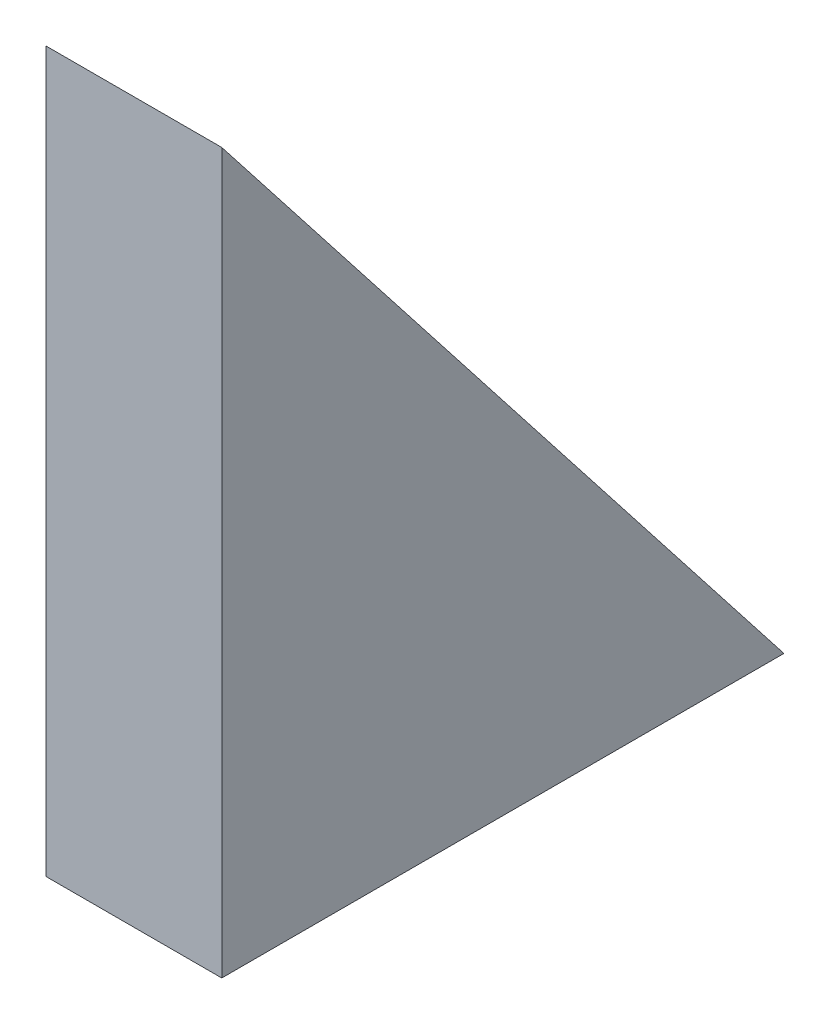
ISO-10303-21;
HEADER;
FILE_DESCRIPTION(('STEP AP214'),'2;1');
FILE_NAME('part.step','',(''),(''),'','','');
FILE_SCHEMA(('AUTOMOTIVE_DESIGN { 1 0 10303 214 1 1 1 1 }'));
ENDSEC;
DATA;
#1=APPLICATION_CONTEXT('core data for automotive mechanical design processes');
#2=APPLICATION_PROTOCOL_DEFINITION('international standard','automotive_design',2000,#1);
#3=PRODUCT_CONTEXT('',#1,'mechanical');
#4=PRODUCT('Part','Part','',(#3));
#5=PRODUCT_RELATED_PRODUCT_CATEGORY('part','',(#4));
#6=PRODUCT_DEFINITION_FORMATION('','',#4);
#7=PRODUCT_DEFINITION_CONTEXT('part definition',#1,'design');
#8=PRODUCT_DEFINITION('design','',#6,#7);
#9=PRODUCT_DEFINITION_SHAPE('','',#8);
#10=(LENGTH_UNIT() NAMED_UNIT(*) SI_UNIT(.MILLI.,.METRE.));
#11=(NAMED_UNIT(*) PLANE_ANGLE_UNIT() SI_UNIT($,.RADIAN.));
#12=(NAMED_UNIT(*) SI_UNIT($,.STERADIAN.) SOLID_ANGLE_UNIT());
#13=UNCERTAINTY_MEASURE_WITH_UNIT(LENGTH_MEASURE(1.E-05),#10,'distance_accuracy_value','');
#14=(GEOMETRIC_REPRESENTATION_CONTEXT(3) GLOBAL_UNCERTAINTY_ASSIGNED_CONTEXT((#13)) GLOBAL_UNIT_ASSIGNED_CONTEXT((#10,
#11,#12)) REPRESENTATION_CONTEXT('',''));
#15=CARTESIAN_POINT('',(0.,0.,0.));
#16=DIRECTION('',(0.,0.,1.));
#17=DIRECTION('',(1.,0.,0.));
#18=AXIS2_PLACEMENT_3D('',#15,#16,#17);
#19=CARTESIAN_POINT('',(7.9375,3.88578058618805E-13,-50.8));
#20=DIRECTION('',(0.,1.,0.));
#21=DIRECTION('',(0.,0.,1.));
#22=AXIS2_PLACEMENT_3D('',#19,#20,#21);
#23=PLANE('',#22);
#24=DIRECTION('',(0.,0.,-1.));
#25=VECTOR('',#24,1.);
#26=CARTESIAN_POINT('',(-7.93749999999999,3.88578058618805E-13,-50.7999999999998));
#27=LINE('',#26,#25);
#28=CARTESIAN_POINT('',(-7.9375,0.,2.22044604925031E-13));
#29=VERTEX_POINT('',#28);
#30=CARTESIAN_POINT('',(-7.93749999999999,3.88578058618805E-13,-50.7999999999998));
#31=VERTEX_POINT('',#30);
#32=EDGE_CURVE('E82',#29,#31,#27,.T.);
#33=ORIENTED_EDGE('',*,*,#32,.T.);
#34=DIRECTION('',(-1.,0.,0.));
#35=VECTOR('',#34,1.);
#36=CARTESIAN_POINT('',(7.9375,3.88578058618805E-13,-50.8));
#37=LINE('',#36,#35);
#38=CARTESIAN_POINT('',(7.9375,3.88578058618805E-13,-50.8));
#39=VERTEX_POINT('',#38);
#40=EDGE_CURVE('E11',#39,#31,#37,.T.);
#41=ORIENTED_EDGE('',*,*,#40,.F.);
#42=DIRECTION('',(0.,0.,-1.));
#43=VECTOR('',#42,1.);
#44=CARTESIAN_POINT('',(7.9375,3.88578058618805E-13,-50.8));
#45=LINE('',#44,#43);
#46=CARTESIAN_POINT('',(7.9375,0.,0.));
#47=VERTEX_POINT('',#46);
#48=EDGE_CURVE('E75',#47,#39,#45,.T.);
#49=ORIENTED_EDGE('',*,*,#48,.F.);
#50=DIRECTION('',(-1.,0.,0.));
#51=VECTOR('',#50,1.);
#52=CARTESIAN_POINT('',(7.9375,0.,0.));
#53=LINE('',#52,#51);
#54=EDGE_CURVE('E83',#47,#29,#53,.T.);
#55=ORIENTED_EDGE('',*,*,#54,.T.);
#56=EDGE_LOOP('',(#33,#41,#49,#55));
#57=FACE_BOUND('',#56,.T.);
#58=ADVANCED_FACE('F35',(#57),#23,.F.);
#59=CARTESIAN_POINT('',(7.93750000000006,65.,-2.22044604925031E-13));
#60=DIRECTION('',(0.,-0.615785170789412,0.787914096482515));
#61=DIRECTION('',(0.,-0.787914096482513,-0.615785170789409));
#62=AXIS2_PLACEMENT_3D('',#59,#60,#61);
#63=PLANE('',#62);
#64=DIRECTION('',(0.,0.787914096482513,0.615785170789409));
#65=VECTOR('',#64,1.);
#66=CARTESIAN_POINT('',(-7.9375,65.,0.));
#67=LINE('',#66,#65);
#68=CARTESIAN_POINT('',(-7.9375,65.,0.));
#69=VERTEX_POINT('',#68);
#70=EDGE_CURVE('E63',#31,#69,#67,.T.);
#71=ORIENTED_EDGE('',*,*,#70,.T.);
#72=DIRECTION('',(-1.,0.,0.));
#73=VECTOR('',#72,1.);
#74=CARTESIAN_POINT('',(7.93750000000006,65.,-2.22044604925031E-13));
#75=LINE('',#74,#73);
#76=CARTESIAN_POINT('',(7.93750000000006,65.,-2.22044604925031E-13));
#77=VERTEX_POINT('',#76);
#78=EDGE_CURVE('E43',#77,#69,#75,.T.);
#79=ORIENTED_EDGE('',*,*,#78,.F.);
#80=DIRECTION('',(0.,0.787914096482513,0.615785170789409));
#81=VECTOR('',#80,1.);
#82=CARTESIAN_POINT('',(7.93750000000006,65.,-2.22044604925031E-13));
#83=LINE('',#82,#81);
#84=EDGE_CURVE('E71',#39,#77,#83,.T.);
#85=ORIENTED_EDGE('',*,*,#84,.F.);
#86=ORIENTED_EDGE('',*,*,#40,.T.);
#87=EDGE_LOOP('',(#71,#79,#85,#86));
#88=FACE_BOUND('',#87,.T.);
#89=ADVANCED_FACE('F72',(#88),#63,.F.);
#90=CARTESIAN_POINT('',(7.9375,0.,0.));
#91=DIRECTION('',(0.,0.,-1.));
#92=DIRECTION('',(-1.,0.,0.));
#93=AXIS2_PLACEMENT_3D('',#90,#91,#92);
#94=PLANE('',#93);
#95=DIRECTION('',(0.,-1.,0.));
#96=VECTOR('',#95,1.);
#97=CARTESIAN_POINT('',(-7.9375,0.,2.22044604925031E-13));
#98=LINE('',#97,#96);
#99=EDGE_CURVE('E68',#69,#29,#98,.T.);
#100=ORIENTED_EDGE('',*,*,#99,.T.);
#101=ORIENTED_EDGE('',*,*,#54,.F.);
#102=DIRECTION('',(0.,-1.,0.));
#103=VECTOR('',#102,1.);
#104=CARTESIAN_POINT('',(7.9375,0.,0.));
#105=LINE('',#104,#103);
#106=EDGE_CURVE('E51',#77,#47,#105,.T.);
#107=ORIENTED_EDGE('',*,*,#106,.F.);
#108=ORIENTED_EDGE('',*,*,#78,.T.);
#109=EDGE_LOOP('',(#100,#101,#107,#108));
#110=FACE_BOUND('',#109,.T.);
#111=ADVANCED_FACE('F90',(#110),#94,.F.);
#112=CARTESIAN_POINT('',(7.9375,0.,0.));
#113=DIRECTION('',(-1.,0.,0.));
#114=DIRECTION('',(0.,0.,1.));
#115=AXIS2_PLACEMENT_3D('',#112,#113,#114);
#116=PLANE('',#115);
#117=ORIENTED_EDGE('',*,*,#48,.T.);
#118=ORIENTED_EDGE('',*,*,#84,.T.);
#119=ORIENTED_EDGE('',*,*,#106,.T.);
#120=EDGE_LOOP('',(#117,#118,#119));
#121=FACE_BOUND('',#120,.T.);
#122=ADVANCED_FACE('F78',(#121),#116,.F.);
#123=CARTESIAN_POINT('',(-7.9375,0.,2.22044604925031E-13));
#124=DIRECTION('',(-1.,0.,0.));
#125=DIRECTION('',(0.,0.,1.));
#126=AXIS2_PLACEMENT_3D('',#123,#124,#125);
#127=PLANE('',#126);
#128=ORIENTED_EDGE('',*,*,#32,.F.);
#129=ORIENTED_EDGE('',*,*,#99,.F.);
#130=ORIENTED_EDGE('',*,*,#70,.F.);
#131=EDGE_LOOP('',(#128,#129,#130));
#132=FACE_BOUND('',#131,.T.);
#133=ADVANCED_FACE('F91',(#132),#127,.T.);
#134=CLOSED_SHELL('',(#58,#89,#111,#122,#133));
#135=MANIFOLD_SOLID_BREP('B2',#134);
#136=ADVANCED_BREP_SHAPE_REPRESENTATION('',(#18,#135),#14);
#137=SHAPE_DEFINITION_REPRESENTATION(#9,#136);
ENDSEC;
END-ISO-10303-21;
